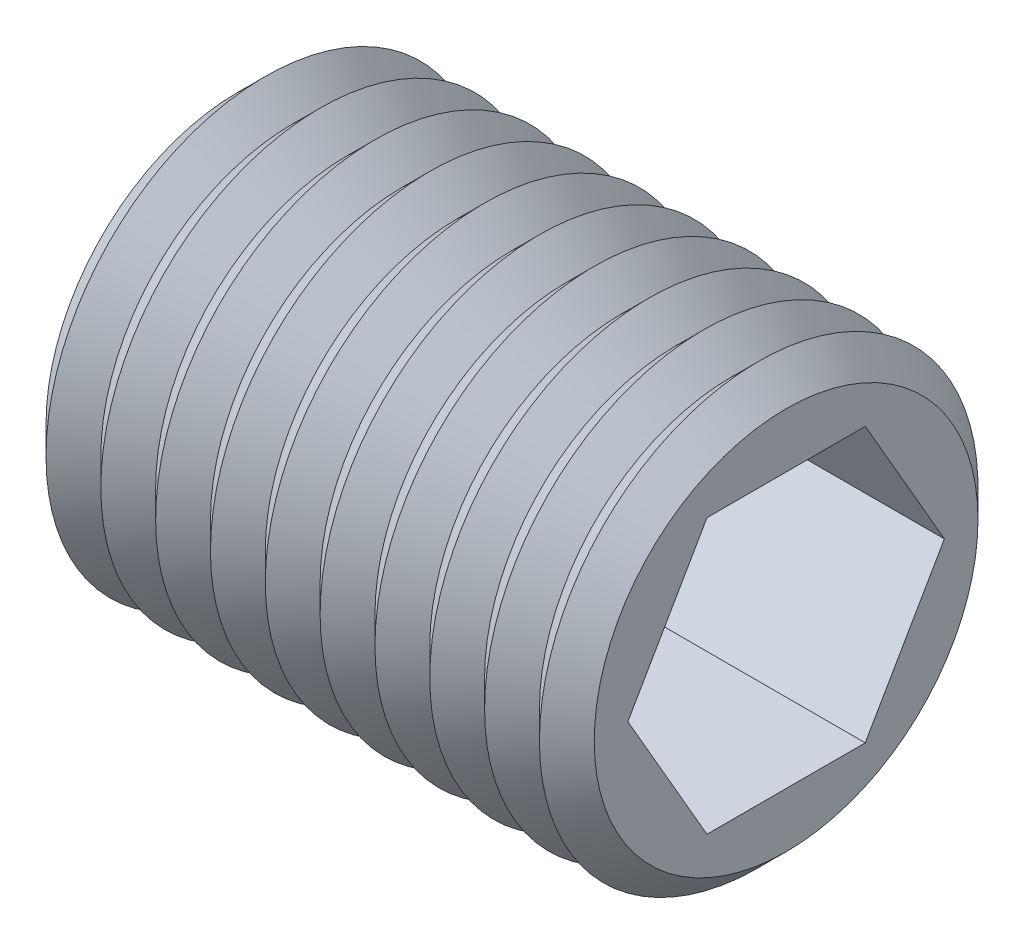
ISO-10303-21;
HEADER;
FILE_DESCRIPTION(('STEP AP214'),'2;1');
FILE_NAME('part.step','',(''),(''),'','','');
FILE_SCHEMA(('AUTOMOTIVE_DESIGN { 1 0 10303 214 1 1 1 1 }'));
ENDSEC;
DATA;
#1=APPLICATION_CONTEXT('core data for automotive mechanical design processes');
#2=APPLICATION_PROTOCOL_DEFINITION('international standard','automotive_design',2000,#1);
#3=PRODUCT_CONTEXT('',#1,'mechanical');
#4=PRODUCT('Part','Part','',(#3));
#5=PRODUCT_RELATED_PRODUCT_CATEGORY('part','',(#4));
#6=PRODUCT_DEFINITION_FORMATION('','',#4);
#7=PRODUCT_DEFINITION_CONTEXT('part definition',#1,'design');
#8=PRODUCT_DEFINITION('design','',#6,#7);
#9=PRODUCT_DEFINITION_SHAPE('','',#8);
#10=(LENGTH_UNIT() NAMED_UNIT(*) SI_UNIT(.MILLI.,.METRE.));
#11=(NAMED_UNIT(*) PLANE_ANGLE_UNIT() SI_UNIT($,.RADIAN.));
#12=(NAMED_UNIT(*) SI_UNIT($,.STERADIAN.) SOLID_ANGLE_UNIT());
#13=UNCERTAINTY_MEASURE_WITH_UNIT(LENGTH_MEASURE(1.E-05),#10,'distance_accuracy_value','');
#14=(GEOMETRIC_REPRESENTATION_CONTEXT(3) GLOBAL_UNCERTAINTY_ASSIGNED_CONTEXT((#13)) GLOBAL_UNIT_ASSIGNED_CONTEXT((#10,
#11,#12)) REPRESENTATION_CONTEXT('',''));
#15=CARTESIAN_POINT('',(0.,0.,0.));
#16=DIRECTION('',(0.,0.,1.));
#17=DIRECTION('',(1.,0.,0.));
#18=AXIS2_PLACEMENT_3D('',#15,#16,#17);
#19=CARTESIAN_POINT('',(9.99999999999979,0.,0.));
#20=DIRECTION('',(-1.,0.,0.));
#21=DIRECTION('',(0.,0.,1.));
#22=AXIS2_PLACEMENT_3D('',#19,#20,#21);
#23=PLANE('',#22);
#24=DIRECTION('',(0.,0.866025403784439,0.5));
#25=VECTOR('',#24,1.);
#26=CARTESIAN_POINT('',(9.99999999999979,0.,-2.88675134594813));
#27=LINE('',#26,#25);
#28=CARTESIAN_POINT('',(9.99999999999979,0.,-2.88675134594813));
#29=VERTEX_POINT('',#28);
#30=CARTESIAN_POINT('',(9.99999999999979,2.5,-1.44337567297407));
#31=VERTEX_POINT('',#30);
#32=EDGE_CURVE('E123',#29,#31,#27,.T.);
#33=ORIENTED_EDGE('',*,*,#32,.F.);
#34=DIRECTION('',(0.,0.866025403784439,-0.5));
#35=VECTOR('',#34,1.);
#36=CARTESIAN_POINT('',(9.99999999999979,-2.5,-1.44337567297407));
#37=LINE('',#36,#35);
#38=CARTESIAN_POINT('',(9.99999999999979,-2.5,-1.44337567297407));
#39=VERTEX_POINT('',#38);
#40=EDGE_CURVE('E49',#39,#29,#37,.T.);
#41=ORIENTED_EDGE('',*,*,#40,.F.);
#42=DIRECTION('',(0.,0.,-1.));
#43=VECTOR('',#42,1.);
#44=CARTESIAN_POINT('',(9.99999999999979,-2.5,1.44337567297406));
#45=LINE('',#44,#43);
#46=CARTESIAN_POINT('',(9.99999999999979,-2.5,1.44337567297406));
#47=VERTEX_POINT('',#46);
#48=EDGE_CURVE('E132',#47,#39,#45,.T.);
#49=ORIENTED_EDGE('',*,*,#48,.F.);
#50=DIRECTION('',(0.,-0.866025403784438,-0.5));
#51=VECTOR('',#50,1.);
#52=CARTESIAN_POINT('',(9.99999999999979,0.,2.88675134594813));
#53=LINE('',#52,#51);
#54=CARTESIAN_POINT('',(9.99999999999979,0.,2.88675134594813));
#55=VERTEX_POINT('',#54);
#56=EDGE_CURVE('E130',#55,#47,#53,.T.);
#57=ORIENTED_EDGE('',*,*,#56,.F.);
#58=DIRECTION('',(0.,-0.866025403784439,0.5));
#59=VECTOR('',#58,1.);
#60=CARTESIAN_POINT('',(9.99999999999979,2.5,1.44337567297407));
#61=LINE('',#60,#59);
#62=CARTESIAN_POINT('',(9.99999999999979,2.5,1.44337567297407));
#63=VERTEX_POINT('',#62);
#64=EDGE_CURVE('E97',#63,#55,#61,.T.);
#65=ORIENTED_EDGE('',*,*,#64,.F.);
#66=DIRECTION('',(0.,0.,1.));
#67=VECTOR('',#66,1.);
#68=CARTESIAN_POINT('',(9.99999999999979,2.5,-1.44337567297407));
#69=LINE('',#68,#67);
#70=EDGE_CURVE('E126',#31,#63,#69,.T.);
#71=ORIENTED_EDGE('',*,*,#70,.F.);
#72=EDGE_LOOP('',(#33,#41,#49,#57,#65,#71));
#73=FACE_BOUND('',#72,.T.);
#74=CARTESIAN_POINT('',(9.99999999999979,0.,0.));
#75=DIRECTION('',(-1.,0.,0.));
#76=DIRECTION('',(0.,0.,1.));
#77=AXIS2_PLACEMENT_3D('',#74,#75,#76);
#78=CIRCLE('',#77,3.50000000000011);
#79=CARTESIAN_POINT('',(9.99999999999979,0.,3.50000000000011));
#80=VERTEX_POINT('',#79);
#81=EDGE_CURVE('E11',#80,#80,#78,.T.);
#82=ORIENTED_EDGE('',*,*,#81,.F.);
#83=EDGE_LOOP('',(#82));
#84=FACE_BOUND('',#83,.T.);
#85=ADVANCED_FACE('F35',(#73,#84),#23,.F.);
#86=CARTESIAN_POINT('',(9.99999999999979,0.,0.));
#87=DIRECTION('',(-1.,0.,0.));
#88=DIRECTION('',(0.,0.,1.));
#89=AXIS2_PLACEMENT_3D('',#86,#87,#88);
#90=CONICAL_SURFACE('',#89,3.50000000000011,0.785398163397448);
#91=CARTESIAN_POINT('',(9.49999999999979,0.,0.));
#92=DIRECTION('',(-1.,0.,0.));
#93=DIRECTION('',(0.,0.,1.));
#94=AXIS2_PLACEMENT_3D('',#91,#92,#93);
#95=CIRCLE('',#94,4.00000000000011);
#96=CARTESIAN_POINT('',(9.49999999999979,0.,4.00000000000011));
#97=VERTEX_POINT('',#96);
#98=EDGE_CURVE('E42',#97,#97,#95,.T.);
#99=ORIENTED_EDGE('',*,*,#98,.F.);
#100=EDGE_LOOP('',(#99));
#101=FACE_BOUND('',#100,.T.);
#102=ORIENTED_EDGE('',*,*,#81,.T.);
#103=EDGE_LOOP('',(#102));
#104=FACE_BOUND('',#103,.T.);
#105=ADVANCED_FACE('F202',(#101,#104),#90,.T.);
#106=CARTESIAN_POINT('',(9.49999999999979,0.,0.));
#107=DIRECTION('',(1.,0.,0.));
#108=DIRECTION('',(0.,0.,-1.));
#109=AXIS2_PLACEMENT_3D('',#106,#107,#108);
#110=CONICAL_SURFACE('',#109,4.00000000000011,0.785398163397448);
#111=CARTESIAN_POINT('',(8.99999999999979,0.,0.));
#112=DIRECTION('',(-1.,0.,0.));
#113=DIRECTION('',(0.,0.,1.));
#114=AXIS2_PLACEMENT_3D('',#111,#112,#113);
#115=CIRCLE('',#114,3.50000000000011);
#116=CARTESIAN_POINT('',(8.99999999999979,0.,3.50000000000011));
#117=VERTEX_POINT('',#116);
#118=EDGE_CURVE('E195',#117,#117,#115,.T.);
#119=ORIENTED_EDGE('',*,*,#118,.F.);
#120=EDGE_LOOP('',(#119));
#121=FACE_BOUND('',#120,.T.);
#122=ORIENTED_EDGE('',*,*,#98,.T.);
#123=EDGE_LOOP('',(#122));
#124=FACE_BOUND('',#123,.T.);
#125=ADVANCED_FACE('F200',(#121,#124),#110,.T.);
#126=CARTESIAN_POINT('',(8.99999999999979,0.,0.));
#127=DIRECTION('',(-1.,0.,0.));
#128=DIRECTION('',(0.,0.,1.));
#129=AXIS2_PLACEMENT_3D('',#126,#127,#128);
#130=CONICAL_SURFACE('',#129,3.50000000000011,0.78539816339745);
#131=CARTESIAN_POINT('',(8.49999999999979,0.,0.));
#132=DIRECTION('',(-1.,0.,0.));
#133=DIRECTION('',(0.,0.,1.));
#134=AXIS2_PLACEMENT_3D('',#131,#132,#133);
#135=CIRCLE('',#134,4.00000000000011);
#136=CARTESIAN_POINT('',(8.49999999999979,0.,4.00000000000011));
#137=VERTEX_POINT('',#136);
#138=EDGE_CURVE('E192',#137,#137,#135,.T.);
#139=ORIENTED_EDGE('',*,*,#138,.F.);
#140=EDGE_LOOP('',(#139));
#141=FACE_BOUND('',#140,.T.);
#142=ORIENTED_EDGE('',*,*,#118,.T.);
#143=EDGE_LOOP('',(#142));
#144=FACE_BOUND('',#143,.T.);
#145=ADVANCED_FACE('F299',(#141,#144),#130,.T.);
#146=CARTESIAN_POINT('',(8.49999999999979,0.,0.));
#147=DIRECTION('',(1.,0.,0.));
#148=DIRECTION('',(0.,0.,-1.));
#149=AXIS2_PLACEMENT_3D('',#146,#147,#148);
#150=CONICAL_SURFACE('',#149,4.00000000000011,0.785398163397448);
#151=CARTESIAN_POINT('',(7.99999999999979,0.,0.));
#152=DIRECTION('',(-1.,0.,0.));
#153=DIRECTION('',(0.,0.,1.));
#154=AXIS2_PLACEMENT_3D('',#151,#152,#153);
#155=CIRCLE('',#154,3.50000000000011);
#156=CARTESIAN_POINT('',(7.99999999999979,0.,3.50000000000011));
#157=VERTEX_POINT('',#156);
#158=EDGE_CURVE('E189',#157,#157,#155,.T.);
#159=ORIENTED_EDGE('',*,*,#158,.F.);
#160=EDGE_LOOP('',(#159));
#161=FACE_BOUND('',#160,.T.);
#162=ORIENTED_EDGE('',*,*,#138,.T.);
#163=EDGE_LOOP('',(#162));
#164=FACE_BOUND('',#163,.T.);
#165=ADVANCED_FACE('F295',(#161,#164),#150,.T.);
#166=CARTESIAN_POINT('',(7.99999999999979,0.,0.));
#167=DIRECTION('',(-1.,0.,0.));
#168=DIRECTION('',(0.,0.,1.));
#169=AXIS2_PLACEMENT_3D('',#166,#167,#168);
#170=CONICAL_SURFACE('',#169,3.50000000000011,0.785398163397448);
#171=CARTESIAN_POINT('',(7.49999999999979,0.,0.));
#172=DIRECTION('',(-1.,0.,0.));
#173=DIRECTION('',(0.,0.,1.));
#174=AXIS2_PLACEMENT_3D('',#171,#172,#173);
#175=CIRCLE('',#174,4.00000000000011);
#176=CARTESIAN_POINT('',(7.49999999999979,0.,4.00000000000011));
#177=VERTEX_POINT('',#176);
#178=EDGE_CURVE('E186',#177,#177,#175,.T.);
#179=ORIENTED_EDGE('',*,*,#178,.F.);
#180=EDGE_LOOP('',(#179));
#181=FACE_BOUND('',#180,.T.);
#182=ORIENTED_EDGE('',*,*,#158,.T.);
#183=EDGE_LOOP('',(#182));
#184=FACE_BOUND('',#183,.T.);
#185=ADVANCED_FACE('F291',(#181,#184),#170,.T.);
#186=CARTESIAN_POINT('',(7.49999999999979,0.,0.));
#187=DIRECTION('',(1.,0.,0.));
#188=DIRECTION('',(0.,0.,-1.));
#189=AXIS2_PLACEMENT_3D('',#186,#187,#188);
#190=CONICAL_SURFACE('',#189,4.00000000000011,0.785398163397449);
#191=CARTESIAN_POINT('',(6.99999999999979,0.,0.));
#192=DIRECTION('',(-1.,0.,0.));
#193=DIRECTION('',(0.,0.,1.));
#194=AXIS2_PLACEMENT_3D('',#191,#192,#193);
#195=CIRCLE('',#194,3.50000000000011);
#196=CARTESIAN_POINT('',(6.99999999999979,0.,3.50000000000011));
#197=VERTEX_POINT('',#196);
#198=EDGE_CURVE('E183',#197,#197,#195,.T.);
#199=ORIENTED_EDGE('',*,*,#198,.F.);
#200=EDGE_LOOP('',(#199));
#201=FACE_BOUND('',#200,.T.);
#202=ORIENTED_EDGE('',*,*,#178,.T.);
#203=EDGE_LOOP('',(#202));
#204=FACE_BOUND('',#203,.T.);
#205=ADVANCED_FACE('F287',(#201,#204),#190,.T.);
#206=CARTESIAN_POINT('',(6.99999999999979,0.,0.));
#207=DIRECTION('',(-1.,0.,0.));
#208=DIRECTION('',(0.,0.,1.));
#209=AXIS2_PLACEMENT_3D('',#206,#207,#208);
#210=CONICAL_SURFACE('',#209,3.50000000000011,0.785398163397449);
#211=CARTESIAN_POINT('',(6.49999999999979,0.,0.));
#212=DIRECTION('',(-1.,0.,0.));
#213=DIRECTION('',(0.,0.,1.));
#214=AXIS2_PLACEMENT_3D('',#211,#212,#213);
#215=CIRCLE('',#214,4.00000000000011);
#216=CARTESIAN_POINT('',(6.49999999999979,0.,4.00000000000011));
#217=VERTEX_POINT('',#216);
#218=EDGE_CURVE('E180',#217,#217,#215,.T.);
#219=ORIENTED_EDGE('',*,*,#218,.F.);
#220=EDGE_LOOP('',(#219));
#221=FACE_BOUND('',#220,.T.);
#222=ORIENTED_EDGE('',*,*,#198,.T.);
#223=EDGE_LOOP('',(#222));
#224=FACE_BOUND('',#223,.T.);
#225=ADVANCED_FACE('F283',(#221,#224),#210,.T.);
#226=CARTESIAN_POINT('',(6.49999999999979,0.,0.));
#227=DIRECTION('',(1.,0.,0.));
#228=DIRECTION('',(0.,0.,-1.));
#229=AXIS2_PLACEMENT_3D('',#226,#227,#228);
#230=CONICAL_SURFACE('',#229,4.00000000000011,0.785398163397448);
#231=CARTESIAN_POINT('',(5.99999999999979,0.,0.));
#232=DIRECTION('',(-1.,0.,0.));
#233=DIRECTION('',(0.,0.,1.));
#234=AXIS2_PLACEMENT_3D('',#231,#232,#233);
#235=CIRCLE('',#234,3.50000000000011);
#236=CARTESIAN_POINT('',(5.99999999999979,0.,3.50000000000011));
#237=VERTEX_POINT('',#236);
#238=EDGE_CURVE('E177',#237,#237,#235,.T.);
#239=ORIENTED_EDGE('',*,*,#238,.F.);
#240=EDGE_LOOP('',(#239));
#241=FACE_BOUND('',#240,.T.);
#242=ORIENTED_EDGE('',*,*,#218,.T.);
#243=EDGE_LOOP('',(#242));
#244=FACE_BOUND('',#243,.T.);
#245=ADVANCED_FACE('F279',(#241,#244),#230,.T.);
#246=CARTESIAN_POINT('',(5.99999999999979,0.,0.));
#247=DIRECTION('',(-1.,0.,0.));
#248=DIRECTION('',(0.,0.,1.));
#249=AXIS2_PLACEMENT_3D('',#246,#247,#248);
#250=CONICAL_SURFACE('',#249,3.50000000000011,0.785398163397448);
#251=CARTESIAN_POINT('',(5.49999999999979,0.,0.));
#252=DIRECTION('',(-1.,0.,0.));
#253=DIRECTION('',(0.,0.,1.));
#254=AXIS2_PLACEMENT_3D('',#251,#252,#253);
#255=CIRCLE('',#254,4.00000000000011);
#256=CARTESIAN_POINT('',(5.49999999999979,0.,4.00000000000011));
#257=VERTEX_POINT('',#256);
#258=EDGE_CURVE('E174',#257,#257,#255,.T.);
#259=ORIENTED_EDGE('',*,*,#258,.F.);
#260=EDGE_LOOP('',(#259));
#261=FACE_BOUND('',#260,.T.);
#262=ORIENTED_EDGE('',*,*,#238,.T.);
#263=EDGE_LOOP('',(#262));
#264=FACE_BOUND('',#263,.T.);
#265=ADVANCED_FACE('F275',(#261,#264),#250,.T.);
#266=CARTESIAN_POINT('',(5.49999999999979,0.,0.));
#267=DIRECTION('',(1.,0.,0.));
#268=DIRECTION('',(0.,0.,-1.));
#269=AXIS2_PLACEMENT_3D('',#266,#267,#268);
#270=CONICAL_SURFACE('',#269,4.00000000000011,0.785398163397449);
#271=CARTESIAN_POINT('',(4.99999999999979,0.,0.));
#272=DIRECTION('',(-1.,0.,0.));
#273=DIRECTION('',(0.,0.,1.));
#274=AXIS2_PLACEMENT_3D('',#271,#272,#273);
#275=CIRCLE('',#274,3.50000000000011);
#276=CARTESIAN_POINT('',(4.99999999999979,0.,3.50000000000011));
#277=VERTEX_POINT('',#276);
#278=EDGE_CURVE('E171',#277,#277,#275,.T.);
#279=ORIENTED_EDGE('',*,*,#278,.F.);
#280=EDGE_LOOP('',(#279));
#281=FACE_BOUND('',#280,.T.);
#282=ORIENTED_EDGE('',*,*,#258,.T.);
#283=EDGE_LOOP('',(#282));
#284=FACE_BOUND('',#283,.T.);
#285=ADVANCED_FACE('F271',(#281,#284),#270,.T.);
#286=CARTESIAN_POINT('',(4.99999999999979,0.,0.));
#287=DIRECTION('',(-1.,0.,0.));
#288=DIRECTION('',(0.,0.,1.));
#289=AXIS2_PLACEMENT_3D('',#286,#287,#288);
#290=CONICAL_SURFACE('',#289,3.50000000000011,0.785398163397449);
#291=CARTESIAN_POINT('',(4.49999999999979,0.,0.));
#292=DIRECTION('',(-1.,0.,0.));
#293=DIRECTION('',(0.,0.,1.));
#294=AXIS2_PLACEMENT_3D('',#291,#292,#293);
#295=CIRCLE('',#294,4.00000000000011);
#296=CARTESIAN_POINT('',(4.49999999999979,0.,4.00000000000011));
#297=VERTEX_POINT('',#296);
#298=EDGE_CURVE('E168',#297,#297,#295,.T.);
#299=ORIENTED_EDGE('',*,*,#298,.F.);
#300=EDGE_LOOP('',(#299));
#301=FACE_BOUND('',#300,.T.);
#302=ORIENTED_EDGE('',*,*,#278,.T.);
#303=EDGE_LOOP('',(#302));
#304=FACE_BOUND('',#303,.T.);
#305=ADVANCED_FACE('F267',(#301,#304),#290,.T.);
#306=CARTESIAN_POINT('',(4.49999999999979,0.,0.));
#307=DIRECTION('',(1.,0.,0.));
#308=DIRECTION('',(0.,0.,-1.));
#309=AXIS2_PLACEMENT_3D('',#306,#307,#308);
#310=CONICAL_SURFACE('',#309,4.00000000000011,0.785398163397448);
#311=CARTESIAN_POINT('',(3.99999999999979,0.,0.));
#312=DIRECTION('',(-1.,0.,0.));
#313=DIRECTION('',(0.,0.,1.));
#314=AXIS2_PLACEMENT_3D('',#311,#312,#313);
#315=CIRCLE('',#314,3.50000000000011);
#316=CARTESIAN_POINT('',(3.99999999999979,0.,3.50000000000011));
#317=VERTEX_POINT('',#316);
#318=EDGE_CURVE('E165',#317,#317,#315,.T.);
#319=ORIENTED_EDGE('',*,*,#318,.F.);
#320=EDGE_LOOP('',(#319));
#321=FACE_BOUND('',#320,.T.);
#322=ORIENTED_EDGE('',*,*,#298,.T.);
#323=EDGE_LOOP('',(#322));
#324=FACE_BOUND('',#323,.T.);
#325=ADVANCED_FACE('F263',(#321,#324),#310,.T.);
#326=CARTESIAN_POINT('',(3.99999999999979,0.,0.));
#327=DIRECTION('',(-1.,0.,0.));
#328=DIRECTION('',(0.,0.,1.));
#329=AXIS2_PLACEMENT_3D('',#326,#327,#328);
#330=CONICAL_SURFACE('',#329,3.50000000000011,0.785398163397448);
#331=CARTESIAN_POINT('',(3.49999999999979,0.,0.));
#332=DIRECTION('',(-1.,0.,0.));
#333=DIRECTION('',(0.,0.,1.));
#334=AXIS2_PLACEMENT_3D('',#331,#332,#333);
#335=CIRCLE('',#334,4.00000000000011);
#336=CARTESIAN_POINT('',(3.49999999999979,0.,4.00000000000011));
#337=VERTEX_POINT('',#336);
#338=EDGE_CURVE('E162',#337,#337,#335,.T.);
#339=ORIENTED_EDGE('',*,*,#338,.F.);
#340=EDGE_LOOP('',(#339));
#341=FACE_BOUND('',#340,.T.);
#342=ORIENTED_EDGE('',*,*,#318,.T.);
#343=EDGE_LOOP('',(#342));
#344=FACE_BOUND('',#343,.T.);
#345=ADVANCED_FACE('F259',(#341,#344),#330,.T.);
#346=CARTESIAN_POINT('',(3.49999999999979,0.,0.));
#347=DIRECTION('',(1.,0.,0.));
#348=DIRECTION('',(0.,0.,-1.));
#349=AXIS2_PLACEMENT_3D('',#346,#347,#348);
#350=CONICAL_SURFACE('',#349,4.00000000000011,0.785398163397449);
#351=CARTESIAN_POINT('',(2.99999999999979,0.,0.));
#352=DIRECTION('',(-1.,0.,0.));
#353=DIRECTION('',(0.,0.,1.));
#354=AXIS2_PLACEMENT_3D('',#351,#352,#353);
#355=CIRCLE('',#354,3.50000000000011);
#356=CARTESIAN_POINT('',(2.99999999999979,0.,3.50000000000011));
#357=VERTEX_POINT('',#356);
#358=EDGE_CURVE('E159',#357,#357,#355,.T.);
#359=ORIENTED_EDGE('',*,*,#358,.F.);
#360=EDGE_LOOP('',(#359));
#361=FACE_BOUND('',#360,.T.);
#362=ORIENTED_EDGE('',*,*,#338,.T.);
#363=EDGE_LOOP('',(#362));
#364=FACE_BOUND('',#363,.T.);
#365=ADVANCED_FACE('F255',(#361,#364),#350,.T.);
#366=CARTESIAN_POINT('',(2.99999999999979,0.,0.));
#367=DIRECTION('',(-1.,0.,0.));
#368=DIRECTION('',(0.,0.,1.));
#369=AXIS2_PLACEMENT_3D('',#366,#367,#368);
#370=CONICAL_SURFACE('',#369,3.50000000000011,0.785398163397449);
#371=CARTESIAN_POINT('',(2.49999999999979,0.,0.));
#372=DIRECTION('',(-1.,0.,0.));
#373=DIRECTION('',(0.,0.,1.));
#374=AXIS2_PLACEMENT_3D('',#371,#372,#373);
#375=CIRCLE('',#374,4.00000000000011);
#376=CARTESIAN_POINT('',(2.49999999999979,0.,4.00000000000011));
#377=VERTEX_POINT('',#376);
#378=EDGE_CURVE('E156',#377,#377,#375,.T.);
#379=ORIENTED_EDGE('',*,*,#378,.F.);
#380=EDGE_LOOP('',(#379));
#381=FACE_BOUND('',#380,.T.);
#382=ORIENTED_EDGE('',*,*,#358,.T.);
#383=EDGE_LOOP('',(#382));
#384=FACE_BOUND('',#383,.T.);
#385=ADVANCED_FACE('F251',(#381,#384),#370,.T.);
#386=CARTESIAN_POINT('',(2.49999999999979,0.,0.));
#387=DIRECTION('',(1.,0.,0.));
#388=DIRECTION('',(0.,0.,-1.));
#389=AXIS2_PLACEMENT_3D('',#386,#387,#388);
#390=CONICAL_SURFACE('',#389,4.00000000000011,0.785398163397448);
#391=CARTESIAN_POINT('',(1.99999999999979,0.,0.));
#392=DIRECTION('',(-1.,0.,0.));
#393=DIRECTION('',(0.,0.,1.));
#394=AXIS2_PLACEMENT_3D('',#391,#392,#393);
#395=CIRCLE('',#394,3.50000000000011);
#396=CARTESIAN_POINT('',(1.99999999999979,0.,3.50000000000011));
#397=VERTEX_POINT('',#396);
#398=EDGE_CURVE('E153',#397,#397,#395,.T.);
#399=ORIENTED_EDGE('',*,*,#398,.F.);
#400=EDGE_LOOP('',(#399));
#401=FACE_BOUND('',#400,.T.);
#402=ORIENTED_EDGE('',*,*,#378,.T.);
#403=EDGE_LOOP('',(#402));
#404=FACE_BOUND('',#403,.T.);
#405=ADVANCED_FACE('F247',(#401,#404),#390,.T.);
#406=CARTESIAN_POINT('',(1.99999999999979,0.,0.));
#407=DIRECTION('',(-1.,0.,0.));
#408=DIRECTION('',(0.,0.,1.));
#409=AXIS2_PLACEMENT_3D('',#406,#407,#408);
#410=CONICAL_SURFACE('',#409,3.50000000000011,0.785398163397448);
#411=CARTESIAN_POINT('',(1.49999999999979,0.,0.));
#412=DIRECTION('',(-1.,0.,0.));
#413=DIRECTION('',(0.,0.,1.));
#414=AXIS2_PLACEMENT_3D('',#411,#412,#413);
#415=CIRCLE('',#414,4.00000000000011);
#416=CARTESIAN_POINT('',(1.49999999999979,0.,4.00000000000011));
#417=VERTEX_POINT('',#416);
#418=EDGE_CURVE('E150',#417,#417,#415,.T.);
#419=ORIENTED_EDGE('',*,*,#418,.F.);
#420=EDGE_LOOP('',(#419));
#421=FACE_BOUND('',#420,.T.);
#422=ORIENTED_EDGE('',*,*,#398,.T.);
#423=EDGE_LOOP('',(#422));
#424=FACE_BOUND('',#423,.T.);
#425=ADVANCED_FACE('F243',(#421,#424),#410,.T.);
#426=CARTESIAN_POINT('',(1.49999999999979,0.,0.));
#427=DIRECTION('',(1.,0.,0.));
#428=DIRECTION('',(0.,0.,-1.));
#429=AXIS2_PLACEMENT_3D('',#426,#427,#428);
#430=CONICAL_SURFACE('',#429,4.00000000000011,0.785398163397448);
#431=CARTESIAN_POINT('',(0.999999999999786,0.,0.));
#432=DIRECTION('',(-1.,0.,0.));
#433=DIRECTION('',(0.,0.,1.));
#434=AXIS2_PLACEMENT_3D('',#431,#432,#433);
#435=CIRCLE('',#434,3.50000000000011);
#436=CARTESIAN_POINT('',(0.999999999999786,0.,3.50000000000011));
#437=VERTEX_POINT('',#436);
#438=EDGE_CURVE('E147',#437,#437,#435,.T.);
#439=ORIENTED_EDGE('',*,*,#438,.F.);
#440=EDGE_LOOP('',(#439));
#441=FACE_BOUND('',#440,.T.);
#442=ORIENTED_EDGE('',*,*,#418,.T.);
#443=EDGE_LOOP('',(#442));
#444=FACE_BOUND('',#443,.T.);
#445=ADVANCED_FACE('F239',(#441,#444),#430,.T.);
#446=CARTESIAN_POINT('',(0.999999999999786,0.,0.));
#447=DIRECTION('',(-1.,0.,0.));
#448=DIRECTION('',(0.,0.,1.));
#449=AXIS2_PLACEMENT_3D('',#446,#447,#448);
#450=CONICAL_SURFACE('',#449,3.50000000000011,0.78539816339745);
#451=CARTESIAN_POINT('',(0.499999999999787,0.,0.));
#452=DIRECTION('',(-1.,0.,0.));
#453=DIRECTION('',(0.,0.,1.));
#454=AXIS2_PLACEMENT_3D('',#451,#452,#453);
#455=CIRCLE('',#454,4.00000000000011);
#456=CARTESIAN_POINT('',(0.499999999999787,0.,4.00000000000011));
#457=VERTEX_POINT('',#456);
#458=EDGE_CURVE('E144',#457,#457,#455,.T.);
#459=ORIENTED_EDGE('',*,*,#458,.F.);
#460=EDGE_LOOP('',(#459));
#461=FACE_BOUND('',#460,.T.);
#462=ORIENTED_EDGE('',*,*,#438,.T.);
#463=EDGE_LOOP('',(#462));
#464=FACE_BOUND('',#463,.T.);
#465=ADVANCED_FACE('F235',(#461,#464),#450,.T.);
#466=CARTESIAN_POINT('',(0.499999999999787,0.,0.));
#467=DIRECTION('',(1.,0.,0.));
#468=DIRECTION('',(0.,0.,-1.));
#469=AXIS2_PLACEMENT_3D('',#466,#467,#468);
#470=CONICAL_SURFACE('',#469,4.00000000000011,0.785398163397448);
#471=CARTESIAN_POINT('',(-2.13370987545147E-13,0.,0.));
#472=DIRECTION('',(-1.,0.,0.));
#473=DIRECTION('',(0.,0.,1.));
#474=AXIS2_PLACEMENT_3D('',#471,#472,#473);
#475=CIRCLE('',#474,3.50000000000011);
#476=CARTESIAN_POINT('',(-2.13370987545147E-13,0.,3.50000000000011));
#477=VERTEX_POINT('',#476);
#478=EDGE_CURVE('E136',#477,#477,#475,.T.);
#479=ORIENTED_EDGE('',*,*,#478,.F.);
#480=EDGE_LOOP('',(#479));
#481=FACE_BOUND('',#480,.T.);
#482=ORIENTED_EDGE('',*,*,#458,.T.);
#483=EDGE_LOOP('',(#482));
#484=FACE_BOUND('',#483,.T.);
#485=ADVANCED_FACE('F227',(#481,#484),#470,.T.);
#486=CARTESIAN_POINT('',(-2.13370987545147E-13,3.50000000000011,0.));
#487=DIRECTION('',(1.,0.,0.));
#488=DIRECTION('',(0.,0.,-1.));
#489=AXIS2_PLACEMENT_3D('',#486,#487,#488);
#490=PLANE('',#489);
#491=ORIENTED_EDGE('',*,*,#478,.T.);
#492=EDGE_LOOP('',(#491));
#493=FACE_BOUND('',#492,.T.);
#494=ADVANCED_FACE('F220',(#493),#490,.F.);
#495=CARTESIAN_POINT('',(4.99999999999979,-2.5,-1.44337567297407));
#496=DIRECTION('',(0.,-0.5,-0.866025403784439));
#497=DIRECTION('',(0.,0.866025403784439,-0.5));
#498=AXIS2_PLACEMENT_3D('',#495,#496,#497);
#499=PLANE('',#498);
#500=ORIENTED_EDGE('',*,*,#40,.T.);
#501=DIRECTION('',(1.,0.,0.));
#502=VECTOR('',#501,1.);
#503=CARTESIAN_POINT('',(4.99999999999979,0.,-2.88675134594813));
#504=LINE('',#503,#502);
#505=CARTESIAN_POINT('',(4.99999999999979,0.,-2.88675134594813));
#506=VERTEX_POINT('',#505);
#507=EDGE_CURVE('E79',#506,#29,#504,.T.);
#508=ORIENTED_EDGE('',*,*,#507,.F.);
#509=DIRECTION('',(0.,0.866025403784439,-0.5));
#510=VECTOR('',#509,1.);
#511=CARTESIAN_POINT('',(4.99999999999979,-2.5,-1.44337567297407));
#512=LINE('',#511,#510);
#513=CARTESIAN_POINT('',(4.99999999999979,-2.5,-1.44337567297407));
#514=VERTEX_POINT('',#513);
#515=EDGE_CURVE('E134',#514,#506,#512,.T.);
#516=ORIENTED_EDGE('',*,*,#515,.F.);
#517=DIRECTION('',(1.,0.,0.));
#518=VECTOR('',#517,1.);
#519=CARTESIAN_POINT('',(4.99999999999979,-2.5,-1.44337567297407));
#520=LINE('',#519,#518);
#521=EDGE_CURVE('E57',#514,#39,#520,.T.);
#522=ORIENTED_EDGE('',*,*,#521,.T.);
#523=EDGE_LOOP('',(#500,#508,#516,#522));
#524=FACE_BOUND('',#523,.T.);
#525=ADVANCED_FACE('F217',(#524),#499,.F.);
#526=CARTESIAN_POINT('',(4.99999999999979,-2.5,1.44337567297406));
#527=DIRECTION('',(0.,-1.,0.));
#528=DIRECTION('',(0.,0.,-1.));
#529=AXIS2_PLACEMENT_3D('',#526,#527,#528);
#530=PLANE('',#529);
#531=ORIENTED_EDGE('',*,*,#48,.T.);
#532=ORIENTED_EDGE('',*,*,#521,.F.);
#533=DIRECTION('',(0.,0.,-1.));
#534=VECTOR('',#533,1.);
#535=CARTESIAN_POINT('',(4.99999999999979,-2.5,1.44337567297406));
#536=LINE('',#535,#534);
#537=CARTESIAN_POINT('',(4.99999999999979,-2.5,1.44337567297406));
#538=VERTEX_POINT('',#537);
#539=EDGE_CURVE('E109',#538,#514,#536,.T.);
#540=ORIENTED_EDGE('',*,*,#539,.F.);
#541=DIRECTION('',(1.,0.,0.));
#542=VECTOR('',#541,1.);
#543=CARTESIAN_POINT('',(4.99999999999979,-2.5,1.44337567297406));
#544=LINE('',#543,#542);
#545=EDGE_CURVE('E101',#538,#47,#544,.T.);
#546=ORIENTED_EDGE('',*,*,#545,.T.);
#547=EDGE_LOOP('',(#531,#532,#540,#546));
#548=FACE_BOUND('',#547,.T.);
#549=ADVANCED_FACE('F219',(#548),#530,.F.);
#550=CARTESIAN_POINT('',(4.99999999999979,0.,2.88675134594813));
#551=DIRECTION('',(0.,-0.5,0.866025403784439));
#552=DIRECTION('',(0.,-0.866025403784439,-0.5));
#553=AXIS2_PLACEMENT_3D('',#550,#551,#552);
#554=PLANE('',#553);
#555=ORIENTED_EDGE('',*,*,#56,.T.);
#556=ORIENTED_EDGE('',*,*,#545,.F.);
#557=DIRECTION('',(0.,-0.866025403784438,-0.5));
#558=VECTOR('',#557,1.);
#559=CARTESIAN_POINT('',(4.99999999999979,0.,2.88675134594813));
#560=LINE('',#559,#558);
#561=CARTESIAN_POINT('',(4.99999999999979,0.,2.88675134594813));
#562=VERTEX_POINT('',#561);
#563=EDGE_CURVE('E105',#562,#538,#560,.T.);
#564=ORIENTED_EDGE('',*,*,#563,.F.);
#565=DIRECTION('',(1.,0.,0.));
#566=VECTOR('',#565,1.);
#567=CARTESIAN_POINT('',(4.99999999999979,0.,2.88675134594813));
#568=LINE('',#567,#566);
#569=EDGE_CURVE('E90',#562,#55,#568,.T.);
#570=ORIENTED_EDGE('',*,*,#569,.T.);
#571=EDGE_LOOP('',(#555,#556,#564,#570));
#572=FACE_BOUND('',#571,.T.);
#573=ADVANCED_FACE('F106',(#572),#554,.F.);
#574=CARTESIAN_POINT('',(4.99999999999979,2.5,1.44337567297407));
#575=DIRECTION('',(0.,0.5,0.866025403784439));
#576=DIRECTION('',(0.,-0.866025403784439,0.5));
#577=AXIS2_PLACEMENT_3D('',#574,#575,#576);
#578=PLANE('',#577);
#579=ORIENTED_EDGE('',*,*,#64,.T.);
#580=ORIENTED_EDGE('',*,*,#569,.F.);
#581=DIRECTION('',(0.,-0.866025403784439,0.5));
#582=VECTOR('',#581,1.);
#583=CARTESIAN_POINT('',(4.99999999999979,2.5,1.44337567297407));
#584=LINE('',#583,#582);
#585=CARTESIAN_POINT('',(4.99999999999979,2.5,1.44337567297407));
#586=VERTEX_POINT('',#585);
#587=EDGE_CURVE('E94',#586,#562,#584,.T.);
#588=ORIENTED_EDGE('',*,*,#587,.F.);
#589=DIRECTION('',(1.,0.,0.));
#590=VECTOR('',#589,1.);
#591=CARTESIAN_POINT('',(4.99999999999979,2.5,1.44337567297407));
#592=LINE('',#591,#590);
#593=EDGE_CURVE('E102',#586,#63,#592,.T.);
#594=ORIENTED_EDGE('',*,*,#593,.T.);
#595=EDGE_LOOP('',(#579,#580,#588,#594));
#596=FACE_BOUND('',#595,.T.);
#597=ADVANCED_FACE('F92',(#596),#578,.F.);
#598=CARTESIAN_POINT('',(4.99999999999979,2.5,-1.44337567297407));
#599=DIRECTION('',(0.,1.,0.));
#600=DIRECTION('',(0.,0.,1.));
#601=AXIS2_PLACEMENT_3D('',#598,#599,#600);
#602=PLANE('',#601);
#603=ORIENTED_EDGE('',*,*,#70,.T.);
#604=ORIENTED_EDGE('',*,*,#593,.F.);
#605=DIRECTION('',(0.,0.,1.));
#606=VECTOR('',#605,1.);
#607=CARTESIAN_POINT('',(4.99999999999979,2.5,-1.44337567297407));
#608=LINE('',#607,#606);
#609=CARTESIAN_POINT('',(4.99999999999979,2.5,-1.44337567297407));
#610=VERTEX_POINT('',#609);
#611=EDGE_CURVE('E115',#610,#586,#608,.T.);
#612=ORIENTED_EDGE('',*,*,#611,.F.);
#613=DIRECTION('',(1.,0.,0.));
#614=VECTOR('',#613,1.);
#615=CARTESIAN_POINT('',(4.99999999999979,2.5,-1.44337567297407));
#616=LINE('',#615,#614);
#617=EDGE_CURVE('E139',#610,#31,#616,.T.);
#618=ORIENTED_EDGE('',*,*,#617,.T.);
#619=EDGE_LOOP('',(#603,#604,#612,#618));
#620=FACE_BOUND('',#619,.T.);
#621=ADVANCED_FACE('F420',(#620),#602,.F.);
#622=CARTESIAN_POINT('',(4.99999999999979,0.,-2.88675134594813));
#623=DIRECTION('',(0.,0.5,-0.866025403784439));
#624=DIRECTION('',(0.,0.866025403784439,0.5));
#625=AXIS2_PLACEMENT_3D('',#622,#623,#624);
#626=PLANE('',#625);
#627=ORIENTED_EDGE('',*,*,#32,.T.);
#628=ORIENTED_EDGE('',*,*,#617,.F.);
#629=DIRECTION('',(0.,0.866025403784439,0.5));
#630=VECTOR('',#629,1.);
#631=CARTESIAN_POINT('',(4.99999999999979,0.,-2.88675134594813));
#632=LINE('',#631,#630);
#633=EDGE_CURVE('E117',#506,#610,#632,.T.);
#634=ORIENTED_EDGE('',*,*,#633,.F.);
#635=ORIENTED_EDGE('',*,*,#507,.T.);
#636=EDGE_LOOP('',(#627,#628,#634,#635));
#637=FACE_BOUND('',#636,.T.);
#638=ADVANCED_FACE('F215',(#637),#626,.F.);
#639=CARTESIAN_POINT('',(4.99999999999979,0.,0.));
#640=DIRECTION('',(1.,0.,0.));
#641=DIRECTION('',(0.,0.,-1.));
#642=AXIS2_PLACEMENT_3D('',#639,#640,#641);
#643=PLANE('',#642);
#644=ORIENTED_EDGE('',*,*,#515,.T.);
#645=ORIENTED_EDGE('',*,*,#633,.T.);
#646=ORIENTED_EDGE('',*,*,#611,.T.);
#647=ORIENTED_EDGE('',*,*,#587,.T.);
#648=ORIENTED_EDGE('',*,*,#563,.T.);
#649=ORIENTED_EDGE('',*,*,#539,.T.);
#650=EDGE_LOOP('',(#644,#645,#646,#647,#648,#649));
#651=FACE_BOUND('',#650,.T.);
#652=ADVANCED_FACE('F112',(#651),#643,.T.);
#653=CLOSED_SHELL('',(#85,#105,#125,#145,#165,#185,#205,#225,#245,#265,#285,#305,#325,#345,#365,
#385,#405,#425,#445,#465,#485,#494,#525,#549,#573,#597,#621,#638,#652));
#654=MANIFOLD_SOLID_BREP('B2',#653);
#655=ADVANCED_BREP_SHAPE_REPRESENTATION('',(#18,#654),#14);
#656=SHAPE_DEFINITION_REPRESENTATION(#9,#655);
ENDSEC;
END-ISO-10303-21;
